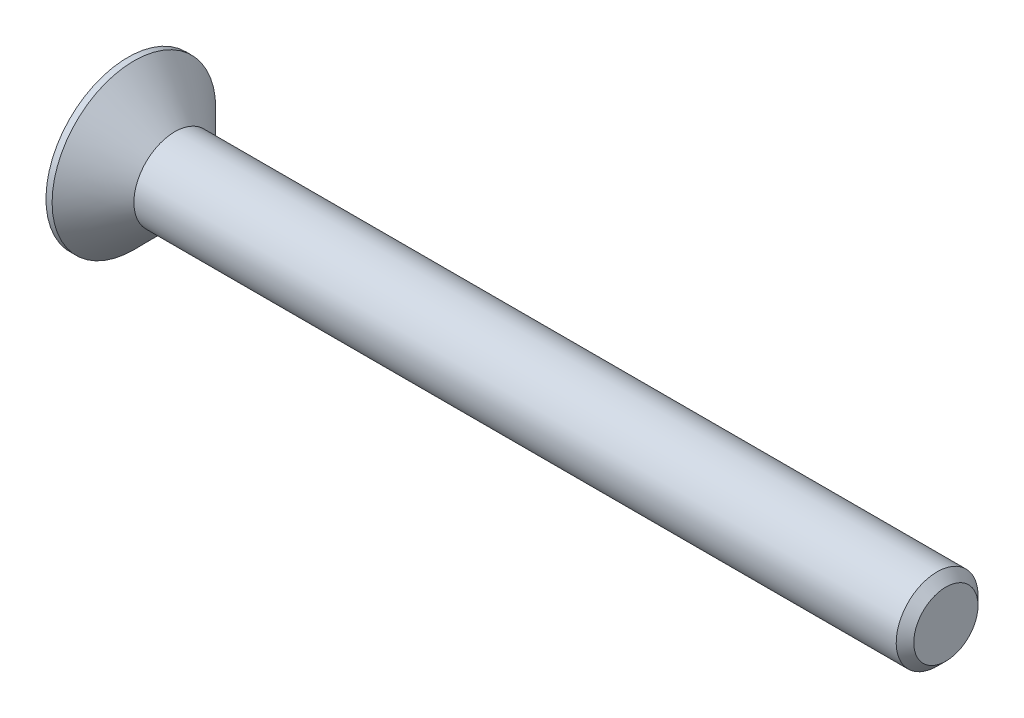
ISO-10303-21;
HEADER;
FILE_DESCRIPTION(('STEP AP214'),'2;1');
FILE_NAME('part.step','',(''),(''),'','','');
FILE_SCHEMA(('AUTOMOTIVE_DESIGN { 1 0 10303 214 1 1 1 1 }'));
ENDSEC;
DATA;
#1=APPLICATION_CONTEXT('core data for automotive mechanical design processes');
#2=APPLICATION_PROTOCOL_DEFINITION('international standard','automotive_design',2000,#1);
#3=PRODUCT_CONTEXT('',#1,'mechanical');
#4=PRODUCT('Part','Part','',(#3));
#5=PRODUCT_RELATED_PRODUCT_CATEGORY('part','',(#4));
#6=PRODUCT_DEFINITION_FORMATION('','',#4);
#7=PRODUCT_DEFINITION_CONTEXT('part definition',#1,'design');
#8=PRODUCT_DEFINITION('design','',#6,#7);
#9=PRODUCT_DEFINITION_SHAPE('','',#8);
#10=(LENGTH_UNIT() NAMED_UNIT(*) SI_UNIT(.MILLI.,.METRE.));
#11=(NAMED_UNIT(*) PLANE_ANGLE_UNIT() SI_UNIT($,.RADIAN.));
#12=(NAMED_UNIT(*) SI_UNIT($,.STERADIAN.) SOLID_ANGLE_UNIT());
#13=UNCERTAINTY_MEASURE_WITH_UNIT(LENGTH_MEASURE(1.E-05),#10,'distance_accuracy_value','');
#14=(GEOMETRIC_REPRESENTATION_CONTEXT(3) GLOBAL_UNCERTAINTY_ASSIGNED_CONTEXT((#13)) GLOBAL_UNIT_ASSIGNED_CONTEXT((#10,
#11,#12)) REPRESENTATION_CONTEXT('',''));
#15=CARTESIAN_POINT('',(0.,0.,0.));
#16=DIRECTION('',(0.,0.,1.));
#17=DIRECTION('',(1.,0.,0.));
#18=AXIS2_PLACEMENT_3D('',#15,#16,#17);
#19=CARTESIAN_POINT('',(1.3,0.,0.));
#20=DIRECTION('',(-1.,0.,0.));
#21=DIRECTION('',(0.,1.,0.));
#22=AXIS2_PLACEMENT_3D('',#19,#20,#21);
#23=CONICAL_SURFACE('',#22,3.,0.7853981633973);
#24=CARTESIAN_POINT('',(2.3,0.,0.));
#25=DIRECTION('',(-1.,0.,0.));
#26=DIRECTION('',(0.,1.,0.));
#27=AXIS2_PLACEMENT_3D('',#24,#25,#26);
#28=CIRCLE('',#27,2.);
#29=CARTESIAN_POINT('',(2.3,2.,0.));
#30=VERTEX_POINT('',#29);
#31=EDGE_CURVE('E11',#30,#30,#28,.T.);
#32=ORIENTED_EDGE('',*,*,#31,.T.);
#33=EDGE_LOOP('',(#32));
#34=FACE_BOUND('',#33,.T.);
#35=CARTESIAN_POINT('',(0.3,0.,0.));
#36=DIRECTION('',(1.,0.,0.));
#37=DIRECTION('',(0.,-1.,0.));
#38=AXIS2_PLACEMENT_3D('',#35,#36,#37);
#39=CIRCLE('',#38,4.);
#40=CARTESIAN_POINT('',(0.3,-4.,0.));
#41=VERTEX_POINT('',#40);
#42=EDGE_CURVE('E27',#41,#41,#39,.T.);
#43=ORIENTED_EDGE('',*,*,#42,.T.);
#44=EDGE_LOOP('',(#43));
#45=FACE_BOUND('',#44,.T.);
#46=ADVANCED_FACE('F17',(#34,#45),#23,.T.);
#47=CARTESIAN_POINT('',(20.93525,0.,0.));
#48=DIRECTION('',(1.,0.,0.));
#49=DIRECTION('',(0.,1.,0.));
#50=AXIS2_PLACEMENT_3D('',#47,#48,#49);
#51=CYLINDRICAL_SURFACE('',#50,2.);
#52=CARTESIAN_POINT('',(39.5705,0.,0.));
#53=DIRECTION('',(1.,0.,0.));
#54=DIRECTION('',(0.,1.,0.));
#55=AXIS2_PLACEMENT_3D('',#52,#53,#54);
#56=CIRCLE('',#55,2.);
#57=CARTESIAN_POINT('',(39.5705,2.,0.));
#58=VERTEX_POINT('',#57);
#59=EDGE_CURVE('E385',#58,#58,#56,.T.);
#60=ORIENTED_EDGE('',*,*,#59,.F.);
#61=EDGE_LOOP('',(#60));
#62=FACE_BOUND('',#61,.T.);
#63=ORIENTED_EDGE('',*,*,#31,.F.);
#64=EDGE_LOOP('',(#63));
#65=FACE_BOUND('',#64,.T.);
#66=ADVANCED_FACE('F112',(#62,#65),#51,.T.);
#67=CARTESIAN_POINT('',(39.78525,0.,0.));
#68=DIRECTION('',(-1.,0.,0.));
#69=DIRECTION('',(0.,1.,0.));
#70=AXIS2_PLACEMENT_3D('',#67,#68,#69);
#71=CONICAL_SURFACE('',#70,1.78525,0.7853981633973);
#72=CARTESIAN_POINT('',(40.,0.,0.));
#73=DIRECTION('',(1.,0.,0.));
#74=DIRECTION('',(0.,-1.,0.));
#75=AXIS2_PLACEMENT_3D('',#72,#73,#74);
#76=CIRCLE('',#75,1.5705);
#77=CARTESIAN_POINT('',(40.,-1.5705,0.));
#78=VERTEX_POINT('',#77);
#79=EDGE_CURVE('E382',#78,#78,#76,.T.);
#80=ORIENTED_EDGE('',*,*,#79,.F.);
#81=EDGE_LOOP('',(#80));
#82=FACE_BOUND('',#81,.T.);
#83=ORIENTED_EDGE('',*,*,#59,.T.);
#84=EDGE_LOOP('',(#83));
#85=FACE_BOUND('',#84,.T.);
#86=ADVANCED_FACE('F118',(#82,#85),#71,.T.);
#87=CARTESIAN_POINT('',(40.,0.78525,0.));
#88=DIRECTION('',(1.,0.,0.));
#89=DIRECTION('',(0.,-1.,0.));
#90=AXIS2_PLACEMENT_3D('',#87,#88,#89);
#91=PLANE('',#90);
#92=ORIENTED_EDGE('',*,*,#79,.T.);
#93=EDGE_LOOP('',(#92));
#94=FACE_BOUND('',#93,.T.);
#95=ADVANCED_FACE('F125',(#94),#91,.T.);
#96=CARTESIAN_POINT('',(0.15,0.,0.));
#97=DIRECTION('',(1.,0.,0.));
#98=DIRECTION('',(0.,1.,0.));
#99=AXIS2_PLACEMENT_3D('',#96,#97,#98);
#100=CYLINDRICAL_SURFACE('',#99,4.);
#101=ORIENTED_EDGE('',*,*,#42,.F.);
#102=EDGE_LOOP('',(#101));
#103=FACE_BOUND('',#102,.T.);
#104=CARTESIAN_POINT('',(0.,0.,0.));
#105=DIRECTION('',(-1.,0.,0.));
#106=DIRECTION('',(0.,-1.,0.));
#107=AXIS2_PLACEMENT_3D('',#104,#105,#106);
#108=CIRCLE('',#107,4.);
#109=CARTESIAN_POINT('',(0.,-4.,0.));
#110=VERTEX_POINT('',#109);
#111=EDGE_CURVE('E255',#110,#110,#108,.T.);
#112=ORIENTED_EDGE('',*,*,#111,.F.);
#113=EDGE_LOOP('',(#112));
#114=FACE_BOUND('',#113,.T.);
#115=ADVANCED_FACE('F129',(#103,#114),#100,.T.);
#116=CARTESIAN_POINT('',(0.,2.625,0.));
#117=DIRECTION('',(-1.,0.,0.));
#118=DIRECTION('',(0.,1.,0.));
#119=AXIS2_PLACEMENT_3D('',#116,#117,#118);
#120=PLANE('',#119);
#121=ORIENTED_EDGE('',*,*,#111,.T.);
#122=EDGE_LOOP('',(#121));
#123=FACE_BOUND('',#122,.T.);
#124=DIRECTION('',(0.,-1.,0.));
#125=VECTOR('',#124,1.);
#126=CARTESIAN_POINT('',(0.,0.721687836487,-1.25));
#127=LINE('',#126,#125);
#128=CARTESIAN_POINT('',(0.,0.721687836487,-1.25));
#129=VERTEX_POINT('',#128);
#130=CARTESIAN_POINT('',(0.,-0.721687836487,-1.25));
#131=VERTEX_POINT('',#130);
#132=EDGE_CURVE('E36',#129,#131,#127,.T.);
#133=ORIENTED_EDGE('',*,*,#132,.F.);
#134=DIRECTION('',(0.,0.500000000000017,0.866025403784429));
#135=VECTOR('',#134,1.);
#136=CARTESIAN_POINT('',(0.,0.721687836487,-1.25));
#137=LINE('',#136,#135);
#138=CARTESIAN_POINT('',(0.,1.443375672974,0.));
#139=VERTEX_POINT('',#138);
#140=EDGE_CURVE('E257',#129,#139,#137,.T.);
#141=ORIENTED_EDGE('',*,*,#140,.T.);
#142=DIRECTION('',(0.,-0.500000000000017,0.866025403784429));
#143=VECTOR('',#142,1.);
#144=CARTESIAN_POINT('',(0.,1.443375672974,0.));
#145=LINE('',#144,#143);
#146=CARTESIAN_POINT('',(0.,0.721687836487,1.25));
#147=VERTEX_POINT('',#146);
#148=EDGE_CURVE('E228',#139,#147,#145,.T.);
#149=ORIENTED_EDGE('',*,*,#148,.T.);
#150=DIRECTION('',(0.,1.,0.));
#151=VECTOR('',#150,1.);
#152=CARTESIAN_POINT('',(0.,-0.721687836487,1.25));
#153=LINE('',#152,#151);
#154=CARTESIAN_POINT('',(0.,-0.721687836487,1.25));
#155=VERTEX_POINT('',#154);
#156=EDGE_CURVE('E169',#155,#147,#153,.T.);
#157=ORIENTED_EDGE('',*,*,#156,.F.);
#158=DIRECTION('',(0.,-0.500000000000017,-0.866025403784429));
#159=VECTOR('',#158,1.);
#160=CARTESIAN_POINT('',(0.,-0.721687836487,1.25));
#161=LINE('',#160,#159);
#162=CARTESIAN_POINT('',(0.,-1.443375672974,0.));
#163=VERTEX_POINT('',#162);
#164=EDGE_CURVE('E167',#155,#163,#161,.T.);
#165=ORIENTED_EDGE('',*,*,#164,.T.);
#166=DIRECTION('',(0.,0.500000000000017,-0.866025403784429));
#167=VECTOR('',#166,1.);
#168=CARTESIAN_POINT('',(0.,-1.443375672974,0.));
#169=LINE('',#168,#167);
#170=EDGE_CURVE('E240',#163,#131,#169,.T.);
#171=ORIENTED_EDGE('',*,*,#170,.T.);
#172=EDGE_LOOP('',(#133,#141,#149,#157,#165,#171));
#173=FACE_BOUND('',#172,.T.);
#174=ADVANCED_FACE('F133',(#123,#173),#120,.T.);
#175=CARTESIAN_POINT('',(0.,-0.721687836487,-1.25));
#176=DIRECTION('',(0.,-0.866025403784429,-0.500000000000017));
#177=DIRECTION('',(0.,0.500000000000017,-0.866025403784429));
#178=AXIS2_PLACEMENT_3D('',#175,#176,#177);
#179=PLANE('',#178);
#180=DIRECTION('',(-1.,0.,0.));
#181=VECTOR('',#180,1.);
#182=CARTESIAN_POINT('',(2.3,-1.443375672974,0.));
#183=LINE('',#182,#181);
#184=CARTESIAN_POINT('',(2.3,-1.443375672974,0.));
#185=VERTEX_POINT('',#184);
#186=EDGE_CURVE('E235',#185,#163,#183,.T.);
#187=ORIENTED_EDGE('',*,*,#186,.F.);
#188=DIRECTION('',(0.,-0.500000000000017,0.866025403784429));
#189=VECTOR('',#188,1.);
#190=CARTESIAN_POINT('',(2.3,-1.082531754731,-0.625));
#191=LINE('',#190,#189);
#192=CARTESIAN_POINT('',(2.3,-1.082531754731,-0.625));
#193=VERTEX_POINT('',#192);
#194=EDGE_CURVE('E189',#193,#185,#191,.T.);
#195=ORIENTED_EDGE('',*,*,#194,.F.);
#196=DIRECTION('',(0.,-0.500000000000017,0.866025403784429));
#197=VECTOR('',#196,1.);
#198=CARTESIAN_POINT('',(2.3,-0.721687836487,-1.25));
#199=LINE('',#198,#197);
#200=CARTESIAN_POINT('',(2.3,-0.721687836487,-1.25));
#201=VERTEX_POINT('',#200);
#202=EDGE_CURVE('E184',#201,#193,#199,.T.);
#203=ORIENTED_EDGE('',*,*,#202,.F.);
#204=DIRECTION('',(-1.,0.,0.));
#205=VECTOR('',#204,1.);
#206=CARTESIAN_POINT('',(2.3,-0.721687836487,-1.25));
#207=LINE('',#206,#205);
#208=EDGE_CURVE('E243',#201,#131,#207,.T.);
#209=ORIENTED_EDGE('',*,*,#208,.T.);
#210=ORIENTED_EDGE('',*,*,#170,.F.);
#211=EDGE_LOOP('',(#187,#195,#203,#209,#210));
#212=FACE_BOUND('',#211,.T.);
#213=ADVANCED_FACE('F137',(#212),#179,.F.);
#214=CARTESIAN_POINT('',(0.,0.721687836487,-1.25));
#215=DIRECTION('',(0.,0.,-1.));
#216=DIRECTION('',(0.,1.,0.));
#217=AXIS2_PLACEMENT_3D('',#214,#215,#216);
#218=PLANE('',#217);
#219=ORIENTED_EDGE('',*,*,#208,.F.);
#220=DIRECTION('',(0.,1.,0.));
#221=VECTOR('',#220,1.);
#222=CARTESIAN_POINT('',(2.3,-0.721687836487,-1.25));
#223=LINE('',#222,#221);
#224=CARTESIAN_POINT('',(2.3,0.,-1.25));
#225=VERTEX_POINT('',#224);
#226=EDGE_CURVE('E246',#201,#225,#223,.T.);
#227=ORIENTED_EDGE('',*,*,#226,.T.);
#228=DIRECTION('',(0.,1.,0.));
#229=VECTOR('',#228,1.);
#230=CARTESIAN_POINT('',(2.3,0.,-1.25));
#231=LINE('',#230,#229);
#232=CARTESIAN_POINT('',(2.3,0.721687836487,-1.25));
#233=VERTEX_POINT('',#232);
#234=EDGE_CURVE('E248',#225,#233,#231,.T.);
#235=ORIENTED_EDGE('',*,*,#234,.T.);
#236=DIRECTION('',(-1.,0.,0.));
#237=VECTOR('',#236,1.);
#238=CARTESIAN_POINT('',(2.3,0.721687836487,-1.25));
#239=LINE('',#238,#237);
#240=EDGE_CURVE('E212',#233,#129,#239,.T.);
#241=ORIENTED_EDGE('',*,*,#240,.T.);
#242=ORIENTED_EDGE('',*,*,#132,.T.);
#243=EDGE_LOOP('',(#219,#227,#235,#241,#242));
#244=FACE_BOUND('',#243,.T.);
#245=ADVANCED_FACE('F141',(#244),#218,.F.);
#246=CARTESIAN_POINT('',(0.,1.443375672974,0.));
#247=DIRECTION('',(0.,0.866025403784429,-0.500000000000017));
#248=DIRECTION('',(0.,0.500000000000017,0.866025403784429));
#249=AXIS2_PLACEMENT_3D('',#246,#247,#248);
#250=PLANE('',#249);
#251=ORIENTED_EDGE('',*,*,#240,.F.);
#252=DIRECTION('',(0.,-0.500000000000017,-0.866025403784429));
#253=VECTOR('',#252,1.);
#254=CARTESIAN_POINT('',(2.3,1.082531754731,-0.625));
#255=LINE('',#254,#253);
#256=CARTESIAN_POINT('',(2.3,1.082531754731,-0.625));
#257=VERTEX_POINT('',#256);
#258=EDGE_CURVE('E199',#257,#233,#255,.T.);
#259=ORIENTED_EDGE('',*,*,#258,.F.);
#260=DIRECTION('',(0.,-0.500000000000017,-0.866025403784429));
#261=VECTOR('',#260,1.);
#262=CARTESIAN_POINT('',(2.3,1.443375672974,0.));
#263=LINE('',#262,#261);
#264=CARTESIAN_POINT('',(2.3,1.443375672974,0.));
#265=VERTEX_POINT('',#264);
#266=EDGE_CURVE('E195',#265,#257,#263,.T.);
#267=ORIENTED_EDGE('',*,*,#266,.F.);
#268=DIRECTION('',(-1.,0.,0.));
#269=VECTOR('',#268,1.);
#270=CARTESIAN_POINT('',(2.3,1.443375672974,0.));
#271=LINE('',#270,#269);
#272=EDGE_CURVE('E216',#265,#139,#271,.T.);
#273=ORIENTED_EDGE('',*,*,#272,.T.);
#274=ORIENTED_EDGE('',*,*,#140,.F.);
#275=EDGE_LOOP('',(#251,#259,#267,#273,#274));
#276=FACE_BOUND('',#275,.T.);
#277=ADVANCED_FACE('F145',(#276),#250,.F.);
#278=CARTESIAN_POINT('',(0.,0.721687836487,1.25));
#279=DIRECTION('',(0.,0.866025403784429,0.500000000000017));
#280=DIRECTION('',(0.,-0.500000000000017,0.866025403784429));
#281=AXIS2_PLACEMENT_3D('',#278,#279,#280);
#282=PLANE('',#281);
#283=ORIENTED_EDGE('',*,*,#272,.F.);
#284=DIRECTION('',(0.,0.500000000000017,-0.866025403784429));
#285=VECTOR('',#284,1.);
#286=CARTESIAN_POINT('',(2.3,1.082531754731,0.625));
#287=LINE('',#286,#285);
#288=CARTESIAN_POINT('',(2.3,1.082531754731,0.625));
#289=VERTEX_POINT('',#288);
#290=EDGE_CURVE('E192',#289,#265,#287,.T.);
#291=ORIENTED_EDGE('',*,*,#290,.F.);
#292=DIRECTION('',(0.,0.500000000000017,-0.866025403784429));
#293=VECTOR('',#292,1.);
#294=CARTESIAN_POINT('',(2.3,0.721687836487,1.25));
#295=LINE('',#294,#293);
#296=CARTESIAN_POINT('',(2.3,0.721687836487,1.25));
#297=VERTEX_POINT('',#296);
#298=EDGE_CURVE('E183',#297,#289,#295,.T.);
#299=ORIENTED_EDGE('',*,*,#298,.F.);
#300=DIRECTION('',(-1.,0.,0.));
#301=VECTOR('',#300,1.);
#302=CARTESIAN_POINT('',(2.3,0.721687836487,1.25));
#303=LINE('',#302,#301);
#304=EDGE_CURVE('E219',#297,#147,#303,.T.);
#305=ORIENTED_EDGE('',*,*,#304,.T.);
#306=ORIENTED_EDGE('',*,*,#148,.F.);
#307=EDGE_LOOP('',(#283,#291,#299,#305,#306));
#308=FACE_BOUND('',#307,.T.);
#309=ADVANCED_FACE('F149',(#308),#282,.F.);
#310=CARTESIAN_POINT('',(0.,-0.721687836487,1.25));
#311=DIRECTION('',(0.,0.,1.));
#312=DIRECTION('',(0.,-1.,0.));
#313=AXIS2_PLACEMENT_3D('',#310,#311,#312);
#314=PLANE('',#313);
#315=ORIENTED_EDGE('',*,*,#304,.F.);
#316=DIRECTION('',(0.,-1.,0.));
#317=VECTOR('',#316,1.);
#318=CARTESIAN_POINT('',(2.3,0.721687836487,1.25));
#319=LINE('',#318,#317);
#320=CARTESIAN_POINT('',(2.3,0.,1.25));
#321=VERTEX_POINT('',#320);
#322=EDGE_CURVE('E175',#297,#321,#319,.T.);
#323=ORIENTED_EDGE('',*,*,#322,.T.);
#324=DIRECTION('',(0.,-1.,0.));
#325=VECTOR('',#324,1.);
#326=CARTESIAN_POINT('',(2.3,0.,1.25));
#327=LINE('',#326,#325);
#328=CARTESIAN_POINT('',(2.3,-0.721687836487,1.25));
#329=VERTEX_POINT('',#328);
#330=EDGE_CURVE('E168',#321,#329,#327,.T.);
#331=ORIENTED_EDGE('',*,*,#330,.T.);
#332=DIRECTION('',(-1.,0.,0.));
#333=VECTOR('',#332,1.);
#334=CARTESIAN_POINT('',(2.3,-0.721687836487,1.25));
#335=LINE('',#334,#333);
#336=EDGE_CURVE('E163',#329,#155,#335,.T.);
#337=ORIENTED_EDGE('',*,*,#336,.T.);
#338=ORIENTED_EDGE('',*,*,#156,.T.);
#339=EDGE_LOOP('',(#315,#323,#331,#337,#338));
#340=FACE_BOUND('',#339,.T.);
#341=ADVANCED_FACE('F153',(#340),#314,.F.);
#342=CARTESIAN_POINT('',(0.,-1.443375672974,0.));
#343=DIRECTION('',(0.,-0.866025403784429,0.500000000000017));
#344=DIRECTION('',(0.,-0.500000000000017,-0.866025403784429));
#345=AXIS2_PLACEMENT_3D('',#342,#343,#344);
#346=PLANE('',#345);
#347=ORIENTED_EDGE('',*,*,#336,.F.);
#348=DIRECTION('',(0.,0.500000000000017,0.866025403784429));
#349=VECTOR('',#348,1.);
#350=CARTESIAN_POINT('',(2.3,-1.082531754731,0.625));
#351=LINE('',#350,#349);
#352=CARTESIAN_POINT('',(2.3,-1.082531754731,0.625));
#353=VERTEX_POINT('',#352);
#354=EDGE_CURVE('E89',#353,#329,#351,.T.);
#355=ORIENTED_EDGE('',*,*,#354,.F.);
#356=DIRECTION('',(0.,0.500000000000017,0.866025403784429));
#357=VECTOR('',#356,1.);
#358=CARTESIAN_POINT('',(2.3,-1.443375672974,0.));
#359=LINE('',#358,#357);
#360=EDGE_CURVE('E186',#185,#353,#359,.T.);
#361=ORIENTED_EDGE('',*,*,#360,.F.);
#362=ORIENTED_EDGE('',*,*,#186,.T.);
#363=ORIENTED_EDGE('',*,*,#164,.F.);
#364=EDGE_LOOP('',(#347,#355,#361,#362,#363));
#365=FACE_BOUND('',#364,.T.);
#366=ADVANCED_FACE('F107',(#365),#346,.F.);
#367=CARTESIAN_POINT('',(2.3,0.,0.));
#368=DIRECTION('',(-1.,0.,0.));
#369=DIRECTION('',(0.,0.,1.));
#370=AXIS2_PLACEMENT_3D('',#367,#368,#369);
#371=PLANE('',#370);
#372=ORIENTED_EDGE('',*,*,#194,.T.);
#373=ORIENTED_EDGE('',*,*,#360,.T.);
#374=CARTESIAN_POINT('',(2.3,0.,0.));
#375=DIRECTION('',(1.,0.,0.));
#376=DIRECTION('',(0.,-0.866025403784454,0.499999999999973));
#377=AXIS2_PLACEMENT_3D('',#374,#375,#376);
#378=CIRCLE('',#377,1.25);
#379=EDGE_CURVE('E190',#353,#193,#378,.T.);
#380=ORIENTED_EDGE('',*,*,#379,.T.);
#381=EDGE_LOOP('',(#372,#373,#380));
#382=FACE_BOUND('',#381,.T.);
#383=ADVANCED_FACE('F96',(#382),#371,.T.);
#384=CARTESIAN_POINT('',(2.648372584001,0.,0.));
#385=DIRECTION('',(-1.,0.,0.));
#386=DIRECTION('',(0.,1.,0.));
#387=AXIS2_PLACEMENT_3D('',#384,#385,#386);
#388=CONICAL_SURFACE('',#387,0.6466009845466,1.0471975511964);
#389=CARTESIAN_POINT('',(2.3,0.,0.));
#390=DIRECTION('',(1.,0.,0.));
#391=DIRECTION('',(0.,-0.866025403784429,-0.500000000000017));
#392=AXIS2_PLACEMENT_3D('',#389,#390,#391);
#393=CIRCLE('',#392,1.25);
#394=EDGE_CURVE('E200',#193,#225,#393,.T.);
#395=ORIENTED_EDGE('',*,*,#394,.F.);
#396=ORIENTED_EDGE('',*,*,#379,.F.);
#397=CARTESIAN_POINT('',(2.3,0.,0.));
#398=DIRECTION('',(1.,0.,0.));
#399=DIRECTION('',(0.,0.,1.));
#400=AXIS2_PLACEMENT_3D('',#397,#398,#399);
#401=CIRCLE('',#400,1.25);
#402=EDGE_CURVE('E181',#321,#353,#401,.T.);
#403=ORIENTED_EDGE('',*,*,#402,.F.);
#404=CARTESIAN_POINT('',(2.3,0.,0.));
#405=DIRECTION('',(1.,0.,0.));
#406=DIRECTION('',(0.,0.866025403784429,0.500000000000017));
#407=AXIS2_PLACEMENT_3D('',#404,#405,#406);
#408=CIRCLE('',#407,1.25);
#409=EDGE_CURVE('E21',#289,#321,#408,.T.);
#410=ORIENTED_EDGE('',*,*,#409,.F.);
#411=CARTESIAN_POINT('',(2.3,0.,0.));
#412=DIRECTION('',(1.,0.,0.));
#413=DIRECTION('',(0.,0.866025403784454,-0.499999999999973));
#414=AXIS2_PLACEMENT_3D('',#411,#412,#413);
#415=CIRCLE('',#414,1.25);
#416=EDGE_CURVE('E193',#257,#289,#415,.T.);
#417=ORIENTED_EDGE('',*,*,#416,.F.);
#418=CARTESIAN_POINT('',(2.3,0.,0.));
#419=DIRECTION('',(1.,0.,0.));
#420=DIRECTION('',(0.,0.,-1.));
#421=AXIS2_PLACEMENT_3D('',#418,#419,#420);
#422=CIRCLE('',#421,1.25);
#423=EDGE_CURVE('E196',#225,#257,#422,.T.);
#424=ORIENTED_EDGE('',*,*,#423,.F.);
#425=EDGE_LOOP('',(#395,#396,#403,#410,#417,#424));
#426=FACE_BOUND('',#425,.T.);
#427=CARTESIAN_POINT('',(3.021687836487,0.,0.));
#428=VERTEX_POINT('',#427);
#429=VERTEX_LOOP('',#428);
#430=FACE_BOUND('',#429,.T.);
#431=ADVANCED_FACE('F93',(#426,#430),#388,.F.);
#432=CARTESIAN_POINT('',(2.3,0.,0.));
#433=DIRECTION('',(-1.,0.,0.));
#434=DIRECTION('',(0.,0.,1.));
#435=AXIS2_PLACEMENT_3D('',#432,#433,#434);
#436=PLANE('',#435);
#437=ORIENTED_EDGE('',*,*,#290,.T.);
#438=ORIENTED_EDGE('',*,*,#266,.T.);
#439=ORIENTED_EDGE('',*,*,#416,.T.);
#440=EDGE_LOOP('',(#437,#438,#439));
#441=FACE_BOUND('',#440,.T.);
#442=ADVANCED_FACE('F95',(#441),#436,.T.);
#443=CARTESIAN_POINT('',(2.3,0.,0.));
#444=DIRECTION('',(-1.,0.,0.));
#445=DIRECTION('',(0.,0.,1.));
#446=AXIS2_PLACEMENT_3D('',#443,#444,#445);
#447=PLANE('',#446);
#448=ORIENTED_EDGE('',*,*,#322,.F.);
#449=ORIENTED_EDGE('',*,*,#298,.T.);
#450=ORIENTED_EDGE('',*,*,#409,.T.);
#451=EDGE_LOOP('',(#448,#449,#450));
#452=FACE_BOUND('',#451,.T.);
#453=ADVANCED_FACE('F104',(#452),#447,.T.);
#454=CARTESIAN_POINT('',(2.3,0.,0.));
#455=DIRECTION('',(-1.,0.,0.));
#456=DIRECTION('',(0.,0.,1.));
#457=AXIS2_PLACEMENT_3D('',#454,#455,#456);
#458=PLANE('',#457);
#459=ORIENTED_EDGE('',*,*,#354,.T.);
#460=ORIENTED_EDGE('',*,*,#330,.F.);
#461=ORIENTED_EDGE('',*,*,#402,.T.);
#462=EDGE_LOOP('',(#459,#460,#461));
#463=FACE_BOUND('',#462,.T.);
#464=ADVANCED_FACE('F180',(#463),#458,.T.);
#465=CARTESIAN_POINT('',(2.3,0.,0.));
#466=DIRECTION('',(-1.,0.,0.));
#467=DIRECTION('',(0.,0.,1.));
#468=AXIS2_PLACEMENT_3D('',#465,#466,#467);
#469=PLANE('',#468);
#470=ORIENTED_EDGE('',*,*,#226,.F.);
#471=ORIENTED_EDGE('',*,*,#202,.T.);
#472=ORIENTED_EDGE('',*,*,#394,.T.);
#473=EDGE_LOOP('',(#470,#471,#472));
#474=FACE_BOUND('',#473,.T.);
#475=ADVANCED_FACE('F259',(#474),#469,.T.);
#476=CARTESIAN_POINT('',(2.3,0.,0.));
#477=DIRECTION('',(-1.,0.,0.));
#478=DIRECTION('',(0.,0.,1.));
#479=AXIS2_PLACEMENT_3D('',#476,#477,#478);
#480=PLANE('',#479);
#481=ORIENTED_EDGE('',*,*,#258,.T.);
#482=ORIENTED_EDGE('',*,*,#234,.F.);
#483=ORIENTED_EDGE('',*,*,#423,.T.);
#484=EDGE_LOOP('',(#481,#482,#483));
#485=FACE_BOUND('',#484,.T.);
#486=ADVANCED_FACE('F19',(#485),#480,.T.);
#487=CLOSED_SHELL('',(#46,#66,#86,#95,#115,#174,#213,#245,#277,#309,#341,#366,#383,#431,#442,
#453,#464,#475,#486));
#488=MANIFOLD_SOLID_BREP('B1',#487);
#489=ADVANCED_BREP_SHAPE_REPRESENTATION('',(#18,#488),#14);
#490=SHAPE_DEFINITION_REPRESENTATION(#9,#489);
ENDSEC;
END-ISO-10303-21;
